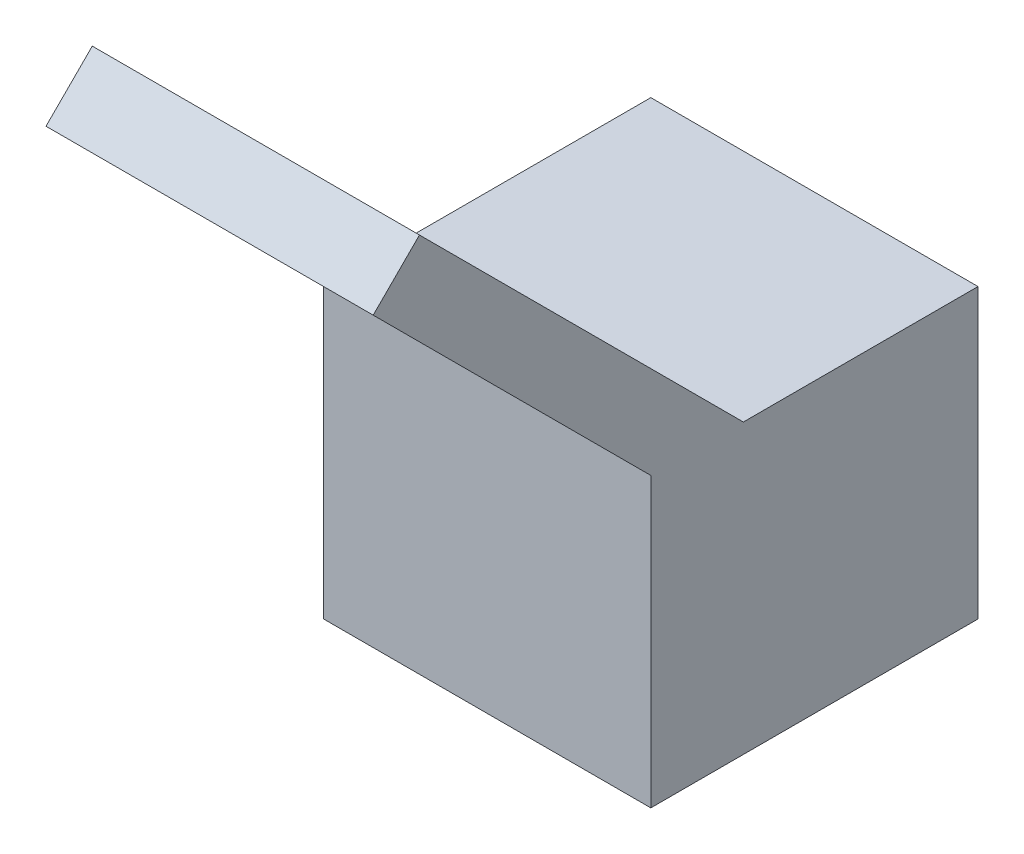
ISO-10303-21;
HEADER;
FILE_DESCRIPTION(('STEP AP214'),'2;1');
FILE_NAME('part.step','',(''),(''),'','','');
FILE_SCHEMA(('AUTOMOTIVE_DESIGN { 1 0 10303 214 1 1 1 1 }'));
ENDSEC;
DATA;
#1=APPLICATION_CONTEXT('core data for automotive mechanical design processes');
#2=APPLICATION_PROTOCOL_DEFINITION('international standard','automotive_design',2000,#1);
#3=PRODUCT_CONTEXT('',#1,'mechanical');
#4=PRODUCT('Part','Part','',(#3));
#5=PRODUCT_RELATED_PRODUCT_CATEGORY('part','',(#4));
#6=PRODUCT_DEFINITION_FORMATION('','',#4);
#7=PRODUCT_DEFINITION_CONTEXT('part definition',#1,'design');
#8=PRODUCT_DEFINITION('design','',#6,#7);
#9=PRODUCT_DEFINITION_SHAPE('','',#8);
#10=(LENGTH_UNIT() NAMED_UNIT(*) SI_UNIT(.MILLI.,.METRE.));
#11=(NAMED_UNIT(*) PLANE_ANGLE_UNIT() SI_UNIT($,.RADIAN.));
#12=(NAMED_UNIT(*) SI_UNIT($,.STERADIAN.) SOLID_ANGLE_UNIT());
#13=UNCERTAINTY_MEASURE_WITH_UNIT(LENGTH_MEASURE(1.E-05),#10,'distance_accuracy_value','');
#14=(GEOMETRIC_REPRESENTATION_CONTEXT(3) GLOBAL_UNCERTAINTY_ASSIGNED_CONTEXT((#13)) GLOBAL_UNIT_ASSIGNED_CONTEXT((#10,
#11,#12)) REPRESENTATION_CONTEXT('',''));
#15=CARTESIAN_POINT('',(0.,0.,0.));
#16=DIRECTION('',(0.,0.,1.));
#17=DIRECTION('',(1.,0.,0.));
#18=AXIS2_PLACEMENT_3D('',#15,#16,#17);
#19=CARTESIAN_POINT('',(0.,0.,0.));
#20=DIRECTION('',(0.,1.,0.));
#21=DIRECTION('',(0.,0.,1.));
#22=AXIS2_PLACEMENT_3D('',#19,#20,#21);
#23=PLANE('',#22);
#24=DIRECTION('',(0.,0.,-1.));
#25=VECTOR('',#24,1.);
#26=CARTESIAN_POINT('',(-12.5,0.,0.));
#27=LINE('',#26,#25);
#28=CARTESIAN_POINT('',(-12.5,0.,5.42893218813454));
#29=VERTEX_POINT('',#28);
#30=CARTESIAN_POINT('',(-12.5,0.,-12.5));
#31=VERTEX_POINT('',#30);
#32=EDGE_CURVE('E129',#29,#31,#27,.T.);
#33=ORIENTED_EDGE('',*,*,#32,.F.);
#34=DIRECTION('',(1.,0.,0.));
#35=VECTOR('',#34,1.);
#36=CARTESIAN_POINT('',(-12.5,0.,5.42893218813454));
#37=LINE('',#36,#35);
#38=CARTESIAN_POINT('',(12.5,0.,5.42893218813454));
#39=VERTEX_POINT('',#38);
#40=EDGE_CURVE('E138',#29,#39,#37,.T.);
#41=ORIENTED_EDGE('',*,*,#40,.T.);
#42=DIRECTION('',(0.,0.,-1.));
#43=VECTOR('',#42,1.);
#44=CARTESIAN_POINT('',(12.5,0.,0.));
#45=LINE('',#44,#43);
#46=CARTESIAN_POINT('',(12.5,0.,-12.5));
#47=VERTEX_POINT('',#46);
#48=EDGE_CURVE('E155',#39,#47,#45,.T.);
#49=ORIENTED_EDGE('',*,*,#48,.T.);
#50=DIRECTION('',(-1.,0.,0.));
#51=VECTOR('',#50,1.);
#52=CARTESIAN_POINT('',(0.,0.,-12.5));
#53=LINE('',#52,#51);
#54=EDGE_CURVE('E148',#47,#31,#53,.T.);
#55=ORIENTED_EDGE('',*,*,#54,.T.);
#56=EDGE_LOOP('',(#33,#41,#49,#55));
#57=FACE_BOUND('',#56,.T.);
#58=ADVANCED_FACE('F39',(#57),#23,.T.);
#59=CARTESIAN_POINT('',(0.,-2.,12.5));
#60=DIRECTION('',(0.,0.,-1.));
#61=DIRECTION('',(-1.,0.,0.));
#62=AXIS2_PLACEMENT_3D('',#59,#60,#61);
#63=PLANE('',#62);
#64=DIRECTION('',(-1.,0.,0.));
#65=VECTOR('',#64,1.);
#66=CARTESIAN_POINT('',(0.,0.,12.5));
#67=LINE('',#66,#65);
#68=CARTESIAN_POINT('',(12.5,0.,12.5));
#69=VERTEX_POINT('',#68);
#70=CARTESIAN_POINT('',(-12.5,0.,12.5));
#71=VERTEX_POINT('',#70);
#72=EDGE_CURVE('E179',#69,#71,#67,.T.);
#73=ORIENTED_EDGE('',*,*,#72,.T.);
#74=DIRECTION('',(0.,1.,0.));
#75=VECTOR('',#74,1.);
#76=CARTESIAN_POINT('',(-12.5,-2.,12.5));
#77=LINE('',#76,#75);
#78=CARTESIAN_POINT('',(-12.5,-22.,12.5));
#79=VERTEX_POINT('',#78);
#80=EDGE_CURVE('E11',#79,#71,#77,.T.);
#81=ORIENTED_EDGE('',*,*,#80,.F.);
#82=DIRECTION('',(1.,0.,0.));
#83=VECTOR('',#82,1.);
#84=CARTESIAN_POINT('',(0.,-22.,12.5));
#85=LINE('',#84,#83);
#86=CARTESIAN_POINT('',(12.5,-22.,12.5));
#87=VERTEX_POINT('',#86);
#88=EDGE_CURVE('E189',#79,#87,#85,.T.);
#89=ORIENTED_EDGE('',*,*,#88,.T.);
#90=DIRECTION('',(0.,1.,0.));
#91=VECTOR('',#90,1.);
#92=CARTESIAN_POINT('',(12.5,-2.,12.5));
#93=LINE('',#92,#91);
#94=EDGE_CURVE('E43',#87,#69,#93,.T.);
#95=ORIENTED_EDGE('',*,*,#94,.T.);
#96=EDGE_LOOP('',(#73,#81,#89,#95));
#97=FACE_BOUND('',#96,.T.);
#98=ADVANCED_FACE('F41',(#97),#63,.F.);
#99=CARTESIAN_POINT('',(-12.5,-2.,0.));
#100=DIRECTION('',(1.,0.,0.));
#101=DIRECTION('',(0.,0.,-1.));
#102=AXIS2_PLACEMENT_3D('',#99,#100,#101);
#103=PLANE('',#102);
#104=ORIENTED_EDGE('',*,*,#80,.T.);
#105=DIRECTION('',(0.,0.707106781186549,0.707106781186546));
#106=VECTOR('',#105,1.);
#107=CARTESIAN_POINT('',(-12.5,-7.25,5.25000000000002));
#108=LINE('',#107,#106);
#109=CARTESIAN_POINT('',(-12.5,21.2132034355965,33.7132034355964));
#110=VERTEX_POINT('',#109);
#111=EDGE_CURVE('E135',#71,#110,#108,.T.);
#112=ORIENTED_EDGE('',*,*,#111,.T.);
#113=DIRECTION('',(0.,0.707106781186547,-0.707106781186548));
#114=VECTOR('',#113,1.);
#115=CARTESIAN_POINT('',(-12.5,26.4632034355964,28.4632034355964));
#116=LINE('',#115,#114);
#117=CARTESIAN_POINT('',(-12.5,24.7487373415292,30.1776695296636));
#118=VERTEX_POINT('',#117);
#119=EDGE_CURVE('E132',#110,#118,#116,.T.);
#120=ORIENTED_EDGE('',*,*,#119,.T.);
#121=DIRECTION('',(0.,-0.707106781186549,-0.707106781186546));
#122=VECTOR('',#121,1.);
#123=CARTESIAN_POINT('',(-12.5,-3.71446609406727,1.71446609406728));
#124=LINE('',#123,#122);
#125=EDGE_CURVE('E126',#118,#29,#124,.T.);
#126=ORIENTED_EDGE('',*,*,#125,.T.);
#127=ORIENTED_EDGE('',*,*,#32,.T.);
#128=DIRECTION('',(0.,1.,0.));
#129=VECTOR('',#128,1.);
#130=CARTESIAN_POINT('',(-12.5,-2.,-12.5));
#131=LINE('',#130,#129);
#132=CARTESIAN_POINT('',(-12.5,-22.,-12.5));
#133=VERTEX_POINT('',#132);
#134=EDGE_CURVE('E49',#133,#31,#131,.T.);
#135=ORIENTED_EDGE('',*,*,#134,.F.);
#136=DIRECTION('',(0.,0.,1.));
#137=VECTOR('',#136,1.);
#138=CARTESIAN_POINT('',(-12.5,-22.,0.));
#139=LINE('',#138,#137);
#140=EDGE_CURVE('E174',#133,#79,#139,.T.);
#141=ORIENTED_EDGE('',*,*,#140,.T.);
#142=EDGE_LOOP('',(#104,#112,#120,#126,#127,#135,#141));
#143=FACE_BOUND('',#142,.T.);
#144=ADVANCED_FACE('F127',(#143),#103,.F.);
#145=CARTESIAN_POINT('',(0.,-2.,-12.5));
#146=DIRECTION('',(0.,0.,-1.));
#147=DIRECTION('',(-1.,0.,0.));
#148=AXIS2_PLACEMENT_3D('',#145,#146,#147);
#149=PLANE('',#148);
#150=CARTESIAN_POINT('',(0.,-11.,-12.5));
#151=DIRECTION('',(0.,0.,1.));
#152=DIRECTION('',(1.,0.,0.));
#153=AXIS2_PLACEMENT_3D('',#150,#151,#152);
#154=CIRCLE('',#153,1.75);
#155=CARTESIAN_POINT('',(1.75,-11.,-12.5));
#156=VERTEX_POINT('',#155);
#157=EDGE_CURVE('E143',#156,#156,#154,.T.);
#158=ORIENTED_EDGE('',*,*,#157,.T.);
#159=EDGE_LOOP('',(#158));
#160=FACE_BOUND('',#159,.T.);
#161=ORIENTED_EDGE('',*,*,#54,.F.);
#162=DIRECTION('',(0.,1.,0.));
#163=VECTOR('',#162,1.);
#164=CARTESIAN_POINT('',(12.5,-2.,-12.5));
#165=LINE('',#164,#163);
#166=CARTESIAN_POINT('',(12.5,-22.,-12.5));
#167=VERTEX_POINT('',#166);
#168=EDGE_CURVE('E154',#167,#47,#165,.T.);
#169=ORIENTED_EDGE('',*,*,#168,.F.);
#170=DIRECTION('',(-1.,0.,0.));
#171=VECTOR('',#170,1.);
#172=CARTESIAN_POINT('',(0.,-22.,-12.5));
#173=LINE('',#172,#171);
#174=EDGE_CURVE('E171',#167,#133,#173,.T.);
#175=ORIENTED_EDGE('',*,*,#174,.T.);
#176=ORIENTED_EDGE('',*,*,#134,.T.);
#177=EDGE_LOOP('',(#161,#169,#175,#176));
#178=FACE_BOUND('',#177,.T.);
#179=ADVANCED_FACE('F170',(#160,#178),#149,.T.);
#180=CARTESIAN_POINT('',(12.5,-2.,0.));
#181=DIRECTION('',(1.,0.,0.));
#182=DIRECTION('',(0.,0.,-1.));
#183=AXIS2_PLACEMENT_3D('',#180,#181,#182);
#184=PLANE('',#183);
#185=ORIENTED_EDGE('',*,*,#48,.F.);
#186=DIRECTION('',(0.,-0.707106781186549,-0.707106781186546));
#187=VECTOR('',#186,1.);
#188=CARTESIAN_POINT('',(12.5,-3.71446609406727,1.71446609406728));
#189=LINE('',#188,#187);
#190=CARTESIAN_POINT('',(12.5,24.7487373415292,30.1776695296636));
#191=VERTEX_POINT('',#190);
#192=EDGE_CURVE('E57',#191,#39,#189,.T.);
#193=ORIENTED_EDGE('',*,*,#192,.F.);
#194=DIRECTION('',(0.,0.707106781186547,-0.707106781186548));
#195=VECTOR('',#194,1.);
#196=CARTESIAN_POINT('',(12.5,26.4632034355964,28.4632034355964));
#197=LINE('',#196,#195);
#198=CARTESIAN_POINT('',(12.5,21.2132034355965,33.7132034355964));
#199=VERTEX_POINT('',#198);
#200=EDGE_CURVE('E136',#199,#191,#197,.T.);
#201=ORIENTED_EDGE('',*,*,#200,.F.);
#202=DIRECTION('',(0.,0.707106781186549,0.707106781186546));
#203=VECTOR('',#202,1.);
#204=CARTESIAN_POINT('',(12.5,-7.25,5.25000000000002));
#205=LINE('',#204,#203);
#206=EDGE_CURVE('E253',#69,#199,#205,.T.);
#207=ORIENTED_EDGE('',*,*,#206,.F.);
#208=ORIENTED_EDGE('',*,*,#94,.F.);
#209=DIRECTION('',(0.,0.,-1.));
#210=VECTOR('',#209,1.);
#211=CARTESIAN_POINT('',(12.5,-22.,0.));
#212=LINE('',#211,#210);
#213=EDGE_CURVE('E166',#87,#167,#212,.T.);
#214=ORIENTED_EDGE('',*,*,#213,.T.);
#215=ORIENTED_EDGE('',*,*,#168,.T.);
#216=EDGE_LOOP('',(#185,#193,#201,#207,#208,#214,#215));
#217=FACE_BOUND('',#216,.T.);
#218=ADVANCED_FACE('F164',(#217),#184,.T.);
#219=CARTESIAN_POINT('',(0.,-22.,0.));
#220=DIRECTION('',(0.,1.,0.));
#221=DIRECTION('',(0.,0.,1.));
#222=AXIS2_PLACEMENT_3D('',#219,#220,#221);
#223=PLANE('',#222);
#224=DIRECTION('',(-1.,0.,0.));
#225=VECTOR('',#224,1.);
#226=CARTESIAN_POINT('',(0.,-22.,-10.5));
#227=LINE('',#226,#225);
#228=CARTESIAN_POINT('',(10.5,-22.,-10.5));
#229=VERTEX_POINT('',#228);
#230=CARTESIAN_POINT('',(-10.5,-22.,-10.5));
#231=VERTEX_POINT('',#230);
#232=EDGE_CURVE('E199',#229,#231,#227,.T.);
#233=ORIENTED_EDGE('',*,*,#232,.T.);
#234=DIRECTION('',(0.,0.,1.));
#235=VECTOR('',#234,1.);
#236=CARTESIAN_POINT('',(-10.5,-22.,0.));
#237=LINE('',#236,#235);
#238=CARTESIAN_POINT('',(-10.5,-22.,10.5));
#239=VERTEX_POINT('',#238);
#240=EDGE_CURVE('E213',#231,#239,#237,.T.);
#241=ORIENTED_EDGE('',*,*,#240,.T.);
#242=DIRECTION('',(1.,0.,0.));
#243=VECTOR('',#242,1.);
#244=CARTESIAN_POINT('',(0.,-22.,10.5));
#245=LINE('',#244,#243);
#246=CARTESIAN_POINT('',(10.5,-22.,10.5));
#247=VERTEX_POINT('',#246);
#248=EDGE_CURVE('E232',#239,#247,#245,.T.);
#249=ORIENTED_EDGE('',*,*,#248,.T.);
#250=DIRECTION('',(0.,0.,-1.));
#251=VECTOR('',#250,1.);
#252=CARTESIAN_POINT('',(10.5,-22.,0.));
#253=LINE('',#252,#251);
#254=EDGE_CURVE('E228',#247,#229,#253,.T.);
#255=ORIENTED_EDGE('',*,*,#254,.T.);
#256=EDGE_LOOP('',(#233,#241,#249,#255));
#257=FACE_BOUND('',#256,.T.);
#258=ORIENTED_EDGE('',*,*,#88,.F.);
#259=ORIENTED_EDGE('',*,*,#140,.F.);
#260=ORIENTED_EDGE('',*,*,#174,.F.);
#261=ORIENTED_EDGE('',*,*,#213,.F.);
#262=EDGE_LOOP('',(#258,#259,#260,#261));
#263=FACE_BOUND('',#262,.T.);
#264=ADVANCED_FACE('F304',(#257,#263),#223,.F.);
#265=CARTESIAN_POINT('',(-10.5,-22.,0.));
#266=DIRECTION('',(-1.,0.,0.));
#267=DIRECTION('',(0.,0.,1.));
#268=AXIS2_PLACEMENT_3D('',#265,#266,#267);
#269=PLANE('',#268);
#270=DIRECTION('',(0.,0.,1.));
#271=VECTOR('',#270,1.);
#272=CARTESIAN_POINT('',(-10.5,-2.,0.));
#273=LINE('',#272,#271);
#274=CARTESIAN_POINT('',(-10.5,-2.,-10.5));
#275=VERTEX_POINT('',#274);
#276=CARTESIAN_POINT('',(-10.5,-2.,10.5));
#277=VERTEX_POINT('',#276);
#278=EDGE_CURVE('E65',#275,#277,#273,.T.);
#279=ORIENTED_EDGE('',*,*,#278,.T.);
#280=DIRECTION('',(0.,1.,0.));
#281=VECTOR('',#280,1.);
#282=CARTESIAN_POINT('',(-10.5,-22.,10.5));
#283=LINE('',#282,#281);
#284=EDGE_CURVE('E194',#239,#277,#283,.T.);
#285=ORIENTED_EDGE('',*,*,#284,.F.);
#286=ORIENTED_EDGE('',*,*,#240,.F.);
#287=DIRECTION('',(0.,1.,0.));
#288=VECTOR('',#287,1.);
#289=CARTESIAN_POINT('',(-10.5,-22.,-10.5));
#290=LINE('',#289,#288);
#291=EDGE_CURVE('E193',#231,#275,#290,.T.);
#292=ORIENTED_EDGE('',*,*,#291,.T.);
#293=EDGE_LOOP('',(#279,#285,#286,#292));
#294=FACE_BOUND('',#293,.T.);
#295=ADVANCED_FACE('F308',(#294),#269,.F.);
#296=CARTESIAN_POINT('',(0.,-22.,-10.5));
#297=DIRECTION('',(0.,0.,-1.));
#298=DIRECTION('',(-1.,0.,0.));
#299=AXIS2_PLACEMENT_3D('',#296,#297,#298);
#300=PLANE('',#299);
#301=CARTESIAN_POINT('',(0.,-11.,-10.5));
#302=DIRECTION('',(0.,0.,-1.));
#303=DIRECTION('',(-1.,0.,0.));
#304=AXIS2_PLACEMENT_3D('',#301,#302,#303);
#305=CIRCLE('',#304,1.75);
#306=CARTESIAN_POINT('',(-1.75,-11.,-10.5));
#307=VERTEX_POINT('',#306);
#308=EDGE_CURVE('E224',#307,#307,#305,.T.);
#309=ORIENTED_EDGE('',*,*,#308,.T.);
#310=EDGE_LOOP('',(#309));
#311=FACE_BOUND('',#310,.T.);
#312=DIRECTION('',(-1.,0.,0.));
#313=VECTOR('',#312,1.);
#314=CARTESIAN_POINT('',(0.,-2.,-10.5));
#315=LINE('',#314,#313);
#316=CARTESIAN_POINT('',(10.5,-2.,-10.5));
#317=VERTEX_POINT('',#316);
#318=EDGE_CURVE('E209',#317,#275,#315,.T.);
#319=ORIENTED_EDGE('',*,*,#318,.T.);
#320=ORIENTED_EDGE('',*,*,#291,.F.);
#321=ORIENTED_EDGE('',*,*,#232,.F.);
#322=DIRECTION('',(0.,1.,0.));
#323=VECTOR('',#322,1.);
#324=CARTESIAN_POINT('',(10.5,-22.,-10.5));
#325=LINE('',#324,#323);
#326=EDGE_CURVE('E203',#229,#317,#325,.T.);
#327=ORIENTED_EDGE('',*,*,#326,.T.);
#328=EDGE_LOOP('',(#319,#320,#321,#327));
#329=FACE_BOUND('',#328,.T.);
#330=ADVANCED_FACE('F313',(#311,#329),#300,.F.);
#331=CARTESIAN_POINT('',(10.5,-22.,0.));
#332=DIRECTION('',(1.,0.,0.));
#333=DIRECTION('',(0.,0.,-1.));
#334=AXIS2_PLACEMENT_3D('',#331,#332,#333);
#335=PLANE('',#334);
#336=DIRECTION('',(0.,0.,-1.));
#337=VECTOR('',#336,1.);
#338=CARTESIAN_POINT('',(10.5,-2.,0.));
#339=LINE('',#338,#337);
#340=CARTESIAN_POINT('',(10.5,-2.,10.5));
#341=VERTEX_POINT('',#340);
#342=EDGE_CURVE('E214',#341,#317,#339,.T.);
#343=ORIENTED_EDGE('',*,*,#342,.T.);
#344=ORIENTED_EDGE('',*,*,#326,.F.);
#345=ORIENTED_EDGE('',*,*,#254,.F.);
#346=DIRECTION('',(0.,1.,0.));
#347=VECTOR('',#346,1.);
#348=CARTESIAN_POINT('',(10.5,-22.,10.5));
#349=LINE('',#348,#347);
#350=EDGE_CURVE('E198',#247,#341,#349,.T.);
#351=ORIENTED_EDGE('',*,*,#350,.T.);
#352=EDGE_LOOP('',(#343,#344,#345,#351));
#353=FACE_BOUND('',#352,.T.);
#354=ADVANCED_FACE('F320',(#353),#335,.F.);
#355=CARTESIAN_POINT('',(0.,-22.,10.5));
#356=DIRECTION('',(0.,0.,1.));
#357=DIRECTION('',(1.,0.,0.));
#358=AXIS2_PLACEMENT_3D('',#355,#356,#357);
#359=PLANE('',#358);
#360=DIRECTION('',(1.,0.,0.));
#361=VECTOR('',#360,1.);
#362=CARTESIAN_POINT('',(0.,-2.,10.5));
#363=LINE('',#362,#361);
#364=EDGE_CURVE('E218',#277,#341,#363,.T.);
#365=ORIENTED_EDGE('',*,*,#364,.T.);
#366=ORIENTED_EDGE('',*,*,#350,.F.);
#367=ORIENTED_EDGE('',*,*,#248,.F.);
#368=ORIENTED_EDGE('',*,*,#284,.T.);
#369=EDGE_LOOP('',(#365,#366,#367,#368));
#370=FACE_BOUND('',#369,.T.);
#371=ADVANCED_FACE('F317',(#370),#359,.F.);
#372=CARTESIAN_POINT('',(0.,-2.,0.));
#373=DIRECTION('',(0.,1.,0.));
#374=DIRECTION('',(0.,0.,1.));
#375=AXIS2_PLACEMENT_3D('',#372,#373,#374);
#376=PLANE('',#375);
#377=ORIENTED_EDGE('',*,*,#278,.F.);
#378=ORIENTED_EDGE('',*,*,#318,.F.);
#379=ORIENTED_EDGE('',*,*,#342,.F.);
#380=ORIENTED_EDGE('',*,*,#364,.F.);
#381=EDGE_LOOP('',(#377,#378,#379,#380));
#382=FACE_BOUND('',#381,.T.);
#383=ADVANCED_FACE('F297',(#382),#376,.F.);
#384=CARTESIAN_POINT('',(0.,-11.,12.501));
#385=DIRECTION('',(0.,0.,-1.));
#386=DIRECTION('',(-1.,0.,0.));
#387=AXIS2_PLACEMENT_3D('',#384,#385,#386);
#388=CYLINDRICAL_SURFACE('',#387,1.75);
#389=ORIENTED_EDGE('',*,*,#157,.F.);
#390=EDGE_LOOP('',(#389));
#391=FACE_BOUND('',#390,.T.);
#392=ORIENTED_EDGE('',*,*,#308,.F.);
#393=EDGE_LOOP('',(#392));
#394=FACE_BOUND('',#393,.T.);
#395=ADVANCED_FACE('F328',(#391,#394),#388,.F.);
#396=CARTESIAN_POINT('',(-12.5,-3.71446609406727,1.71446609406728));
#397=DIRECTION('',(0.,-0.707106781186546,0.707106781186549));
#398=DIRECTION('',(0.,-0.707106781186549,-0.707106781186546));
#399=AXIS2_PLACEMENT_3D('',#396,#397,#398);
#400=PLANE('',#399);
#401=CARTESIAN_POINT('',(0.,14.142135623731,19.5710678118655));
#402=DIRECTION('',(0.,-0.707106781186546,0.707106781186549));
#403=DIRECTION('',(0.,-0.707106781186549,-0.707106781186546));
#404=AXIS2_PLACEMENT_3D('',#401,#402,#403);
#405=CIRCLE('',#404,3.3782);
#406=CARTESIAN_POINT('',(0.,11.7533874955266,17.1823196836611));
#407=VERTEX_POINT('',#406);
#408=EDGE_CURVE('E258',#407,#407,#405,.T.);
#409=ORIENTED_EDGE('',*,*,#408,.T.);
#410=EDGE_LOOP('',(#409));
#411=FACE_BOUND('',#410,.T.);
#412=ORIENTED_EDGE('',*,*,#192,.T.);
#413=ORIENTED_EDGE('',*,*,#40,.F.);
#414=ORIENTED_EDGE('',*,*,#125,.F.);
#415=DIRECTION('',(1.,0.,0.));
#416=VECTOR('',#415,1.);
#417=CARTESIAN_POINT('',(-12.5,24.7487373415292,30.1776695296636));
#418=LINE('',#417,#416);
#419=EDGE_CURVE('E248',#118,#191,#418,.T.);
#420=ORIENTED_EDGE('',*,*,#419,.T.);
#421=EDGE_LOOP('',(#412,#413,#414,#420));
#422=FACE_BOUND('',#421,.T.);
#423=ADVANCED_FACE('F139',(#411,#422),#400,.F.);
#424=CARTESIAN_POINT('',(-12.5,-7.25,5.25000000000002));
#425=DIRECTION('',(0.,0.707106781186547,-0.707106781186549));
#426=DIRECTION('',(0.,0.707106781186549,0.707106781186547));
#427=AXIS2_PLACEMENT_3D('',#424,#425,#426);
#428=PLANE('',#427);
#429=CARTESIAN_POINT('',(0.,10.6066017177982,23.1066017177982));
#430=DIRECTION('',(0.,-0.707106781186547,0.707106781186548));
#431=DIRECTION('',(0.,-0.707106781186548,-0.707106781186547));
#432=AXIS2_PLACEMENT_3D('',#429,#430,#431);
#433=CIRCLE('',#432,3.3782);
#434=CARTESIAN_POINT('',(0.,8.21785358959382,20.7178535895938));
#435=VERTEX_POINT('',#434);
#436=EDGE_CURVE('E266',#435,#435,#433,.T.);
#437=ORIENTED_EDGE('',*,*,#436,.F.);
#438=EDGE_LOOP('',(#437));
#439=FACE_BOUND('',#438,.T.);
#440=ORIENTED_EDGE('',*,*,#206,.T.);
#441=DIRECTION('',(1.,0.,0.));
#442=VECTOR('',#441,1.);
#443=CARTESIAN_POINT('',(-12.5,21.2132034355965,33.7132034355964));
#444=LINE('',#443,#442);
#445=EDGE_CURVE('E144',#110,#199,#444,.T.);
#446=ORIENTED_EDGE('',*,*,#445,.F.);
#447=ORIENTED_EDGE('',*,*,#111,.F.);
#448=ORIENTED_EDGE('',*,*,#72,.F.);
#449=EDGE_LOOP('',(#440,#446,#447,#448));
#450=FACE_BOUND('',#449,.T.);
#451=ADVANCED_FACE('F274',(#439,#450),#428,.F.);
#452=CARTESIAN_POINT('',(-12.5,26.4632034355964,28.4632034355964));
#453=DIRECTION('',(0.,-0.707106781186548,-0.707106781186547));
#454=DIRECTION('',(0.,0.707106781186547,-0.707106781186548));
#455=AXIS2_PLACEMENT_3D('',#452,#453,#454);
#456=PLANE('',#455);
#457=ORIENTED_EDGE('',*,*,#200,.T.);
#458=ORIENTED_EDGE('',*,*,#419,.F.);
#459=ORIENTED_EDGE('',*,*,#119,.F.);
#460=ORIENTED_EDGE('',*,*,#445,.T.);
#461=EDGE_LOOP('',(#457,#458,#459,#460));
#462=FACE_BOUND('',#461,.T.);
#463=ADVANCED_FACE('F277',(#462),#456,.F.);
#464=CARTESIAN_POINT('',(0.,35.4809703885628,-1.76776695296643));
#465=DIRECTION('',(0.,-0.707106781186547,0.707106781186548));
#466=DIRECTION('',(0.,-0.707106781186548,-0.707106781186547));
#467=AXIS2_PLACEMENT_3D('',#464,#465,#466);
#468=CYLINDRICAL_SURFACE('',#467,3.3782);
#469=ORIENTED_EDGE('',*,*,#436,.T.);
#470=EDGE_LOOP('',(#469));
#471=FACE_BOUND('',#470,.T.);
#472=ORIENTED_EDGE('',*,*,#408,.F.);
#473=EDGE_LOOP('',(#472));
#474=FACE_BOUND('',#473,.T.);
#475=ADVANCED_FACE('F271',(#471,#474),#468,.F.);
#476=CLOSED_SHELL('',(#58,#98,#144,#179,#218,#264,#295,#330,#354,#371,#383,#395,#423,#451,#463,#475));
#477=MANIFOLD_SOLID_BREP('B2',#476);
#478=ADVANCED_BREP_SHAPE_REPRESENTATION('',(#18,#477),#14);
#479=SHAPE_DEFINITION_REPRESENTATION(#9,#478);
ENDSEC;
END-ISO-10303-21;
